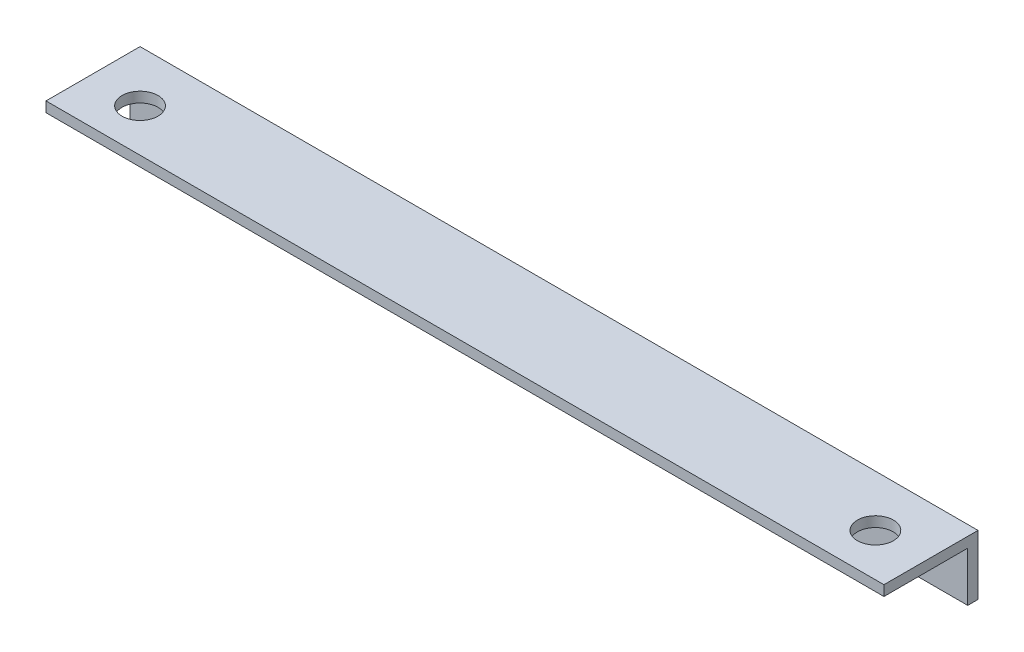
ISO-10303-21;
HEADER;
FILE_DESCRIPTION(('STEP AP214'),'2;1');
FILE_NAME('part.step','',(''),(''),'','','');
FILE_SCHEMA(('AUTOMOTIVE_DESIGN { 1 0 10303 214 1 1 1 1 }'));
ENDSEC;
DATA;
#1=APPLICATION_CONTEXT('core data for automotive mechanical design processes');
#2=APPLICATION_PROTOCOL_DEFINITION('international standard','automotive_design',2000,#1);
#3=PRODUCT_CONTEXT('',#1,'mechanical');
#4=PRODUCT('Part','Part','',(#3));
#5=PRODUCT_RELATED_PRODUCT_CATEGORY('part','',(#4));
#6=PRODUCT_DEFINITION_FORMATION('','',#4);
#7=PRODUCT_DEFINITION_CONTEXT('part definition',#1,'design');
#8=PRODUCT_DEFINITION('design','',#6,#7);
#9=PRODUCT_DEFINITION_SHAPE('','',#8);
#10=(LENGTH_UNIT() NAMED_UNIT(*) SI_UNIT(.MILLI.,.METRE.));
#11=(NAMED_UNIT(*) PLANE_ANGLE_UNIT() SI_UNIT($,.RADIAN.));
#12=(NAMED_UNIT(*) SI_UNIT($,.STERADIAN.) SOLID_ANGLE_UNIT());
#13=UNCERTAINTY_MEASURE_WITH_UNIT(LENGTH_MEASURE(1.E-05),#10,'distance_accuracy_value','');
#14=(GEOMETRIC_REPRESENTATION_CONTEXT(3) GLOBAL_UNCERTAINTY_ASSIGNED_CONTEXT((#13)) GLOBAL_UNIT_ASSIGNED_CONTEXT((#10,
#11,#12)) REPRESENTATION_CONTEXT('',''));
#15=CARTESIAN_POINT('',(0.,0.,0.));
#16=DIRECTION('',(0.,0.,1.));
#17=DIRECTION('',(1.,0.,0.));
#18=AXIS2_PLACEMENT_3D('',#15,#16,#17);
#19=CARTESIAN_POINT('',(0.,0.,1.2));
#20=DIRECTION('',(0.,0.,-1.));
#21=DIRECTION('',(-1.,0.,0.));
#22=AXIS2_PLACEMENT_3D('',#19,#20,#21);
#23=PLANE('',#22);
#24=DIRECTION('',(0.,1.,0.));
#25=VECTOR('',#24,1.);
#26=CARTESIAN_POINT('',(49.,-3.5,1.2));
#27=LINE('',#26,#25);
#28=CARTESIAN_POINT('',(49.,-3.5,1.2));
#29=VERTEX_POINT('',#28);
#30=CARTESIAN_POINT('',(49.,2.3,1.2));
#31=VERTEX_POINT('',#30);
#32=EDGE_CURVE('E94',#29,#31,#27,.T.);
#33=ORIENTED_EDGE('',*,*,#32,.T.);
#34=DIRECTION('',(-1.,0.,0.));
#35=VECTOR('',#34,1.);
#36=CARTESIAN_POINT('',(-49.,2.3,1.2));
#37=LINE('',#36,#35);
#38=CARTESIAN_POINT('',(-49.,2.3,1.2));
#39=VERTEX_POINT('',#38);
#40=EDGE_CURVE('E152',#31,#39,#37,.T.);
#41=ORIENTED_EDGE('',*,*,#40,.T.);
#42=DIRECTION('',(0.,-1.,0.));
#43=VECTOR('',#42,1.);
#44=CARTESIAN_POINT('',(-49.,-3.5,1.2));
#45=LINE('',#44,#43);
#46=CARTESIAN_POINT('',(-49.,-3.5,1.2));
#47=VERTEX_POINT('',#46);
#48=EDGE_CURVE('E160',#39,#47,#45,.T.);
#49=ORIENTED_EDGE('',*,*,#48,.T.);
#50=DIRECTION('',(1.,0.,0.));
#51=VECTOR('',#50,1.);
#52=CARTESIAN_POINT('',(-49.,-3.5,1.2));
#53=LINE('',#52,#51);
#54=EDGE_CURVE('E64',#47,#29,#53,.T.);
#55=ORIENTED_EDGE('',*,*,#54,.T.);
#56=EDGE_LOOP('',(#33,#41,#49,#55));
#57=FACE_BOUND('',#56,.T.);
#58=CARTESIAN_POINT('',(-35.,-0.700000000000001,1.2));
#59=DIRECTION('',(0.,0.,1.));
#60=DIRECTION('',(1.,0.,0.));
#61=AXIS2_PLACEMENT_3D('',#58,#59,#60);
#62=CIRCLE('',#61,1.6);
#63=CARTESIAN_POINT('',(-33.4,-0.700000000000001,1.2));
#64=VERTEX_POINT('',#63);
#65=EDGE_CURVE('E108',#64,#64,#62,.T.);
#66=ORIENTED_EDGE('',*,*,#65,.F.);
#67=EDGE_LOOP('',(#66));
#68=FACE_BOUND('',#67,.T.);
#69=CARTESIAN_POINT('',(35.,-0.700000000000001,1.2));
#70=DIRECTION('',(0.,0.,1.));
#71=DIRECTION('',(-1.,0.,0.));
#72=AXIS2_PLACEMENT_3D('',#69,#70,#71);
#73=CIRCLE('',#72,1.6);
#74=CARTESIAN_POINT('',(33.4,-0.700000000000001,1.2));
#75=VERTEX_POINT('',#74);
#76=EDGE_CURVE('E177',#75,#75,#73,.T.);
#77=ORIENTED_EDGE('',*,*,#76,.F.);
#78=EDGE_LOOP('',(#77));
#79=FACE_BOUND('',#78,.T.);
#80=ADVANCED_FACE('F39',(#57,#68,#79),#23,.F.);
#81=CARTESIAN_POINT('',(0.,0.,0.));
#82=DIRECTION('',(0.,0.,-1.));
#83=DIRECTION('',(-1.,0.,0.));
#84=AXIS2_PLACEMENT_3D('',#81,#82,#83);
#85=PLANE('',#84);
#86=CARTESIAN_POINT('',(-35.,-0.700000000000001,0.));
#87=DIRECTION('',(0.,0.,1.));
#88=DIRECTION('',(1.,0.,0.));
#89=AXIS2_PLACEMENT_3D('',#86,#87,#88);
#90=CIRCLE('',#89,1.6);
#91=CARTESIAN_POINT('',(-33.4,-0.700000000000001,0.));
#92=VERTEX_POINT('',#91);
#93=EDGE_CURVE('E114',#92,#92,#90,.T.);
#94=ORIENTED_EDGE('',*,*,#93,.T.);
#95=EDGE_LOOP('',(#94));
#96=FACE_BOUND('',#95,.T.);
#97=DIRECTION('',(0.,1.,0.));
#98=VECTOR('',#97,1.);
#99=CARTESIAN_POINT('',(49.,-3.5,0.));
#100=LINE('',#99,#98);
#101=CARTESIAN_POINT('',(49.,-3.5,0.));
#102=VERTEX_POINT('',#101);
#103=CARTESIAN_POINT('',(49.,3.5,0.));
#104=VERTEX_POINT('',#103);
#105=EDGE_CURVE('E100',#102,#104,#100,.T.);
#106=ORIENTED_EDGE('',*,*,#105,.F.);
#107=DIRECTION('',(1.,0.,0.));
#108=VECTOR('',#107,1.);
#109=CARTESIAN_POINT('',(-49.,-3.5,0.));
#110=LINE('',#109,#108);
#111=CARTESIAN_POINT('',(-49.,-3.5,0.));
#112=VERTEX_POINT('',#111);
#113=EDGE_CURVE('E83',#112,#102,#110,.T.);
#114=ORIENTED_EDGE('',*,*,#113,.F.);
#115=DIRECTION('',(0.,-1.,0.));
#116=VECTOR('',#115,1.);
#117=CARTESIAN_POINT('',(-49.,-3.5,0.));
#118=LINE('',#117,#116);
#119=CARTESIAN_POINT('',(-49.,3.5,0.));
#120=VERTEX_POINT('',#119);
#121=EDGE_CURVE('E95',#120,#112,#118,.T.);
#122=ORIENTED_EDGE('',*,*,#121,.F.);
#123=DIRECTION('',(-1.,0.,0.));
#124=VECTOR('',#123,1.);
#125=CARTESIAN_POINT('',(-49.,3.5,0.));
#126=LINE('',#125,#124);
#127=EDGE_CURVE('E106',#104,#120,#126,.T.);
#128=ORIENTED_EDGE('',*,*,#127,.F.);
#129=EDGE_LOOP('',(#106,#114,#122,#128));
#130=FACE_BOUND('',#129,.T.);
#131=CARTESIAN_POINT('',(35.,-0.700000000000001,0.));
#132=DIRECTION('',(0.,0.,1.));
#133=DIRECTION('',(-1.,0.,0.));
#134=AXIS2_PLACEMENT_3D('',#131,#132,#133);
#135=CIRCLE('',#134,1.6);
#136=CARTESIAN_POINT('',(33.4,-0.700000000000001,0.));
#137=VERTEX_POINT('',#136);
#138=EDGE_CURVE('E175',#137,#137,#135,.T.);
#139=ORIENTED_EDGE('',*,*,#138,.T.);
#140=EDGE_LOOP('',(#139));
#141=FACE_BOUND('',#140,.T.);
#142=ADVANCED_FACE('F104',(#96,#130,#141),#85,.T.);
#143=CARTESIAN_POINT('',(49.,-3.5,1.2));
#144=DIRECTION('',(-1.,0.,0.));
#145=DIRECTION('',(0.,0.,1.));
#146=AXIS2_PLACEMENT_3D('',#143,#144,#145);
#147=PLANE('',#146);
#148=ORIENTED_EDGE('',*,*,#105,.T.);
#149=DIRECTION('',(0.,0.,-1.));
#150=VECTOR('',#149,1.);
#151=CARTESIAN_POINT('',(49.,3.5,1.2));
#152=LINE('',#151,#150);
#153=CARTESIAN_POINT('',(49.,3.5,11.));
#154=VERTEX_POINT('',#153);
#155=EDGE_CURVE('E11',#154,#104,#152,.T.);
#156=ORIENTED_EDGE('',*,*,#155,.F.);
#157=DIRECTION('',(0.,1.,0.));
#158=VECTOR('',#157,1.);
#159=CARTESIAN_POINT('',(49.,2.3,11.));
#160=LINE('',#159,#158);
#161=CARTESIAN_POINT('',(49.,2.3,11.));
#162=VERTEX_POINT('',#161);
#163=EDGE_CURVE('E151',#162,#154,#160,.T.);
#164=ORIENTED_EDGE('',*,*,#163,.F.);
#165=DIRECTION('',(0.,0.,-1.));
#166=VECTOR('',#165,1.);
#167=CARTESIAN_POINT('',(49.,2.3,1.2));
#168=LINE('',#167,#166);
#169=EDGE_CURVE('E156',#162,#31,#168,.T.);
#170=ORIENTED_EDGE('',*,*,#169,.T.);
#171=ORIENTED_EDGE('',*,*,#32,.F.);
#172=DIRECTION('',(0.,0.,-1.));
#173=VECTOR('',#172,1.);
#174=CARTESIAN_POINT('',(49.,-3.5,1.2));
#175=LINE('',#174,#173);
#176=EDGE_CURVE('E86',#29,#102,#175,.T.);
#177=ORIENTED_EDGE('',*,*,#176,.T.);
#178=EDGE_LOOP('',(#148,#156,#164,#170,#171,#177));
#179=FACE_BOUND('',#178,.T.);
#180=ADVANCED_FACE('F41',(#179),#147,.F.);
#181=CARTESIAN_POINT('',(-49.,3.5,1.2));
#182=DIRECTION('',(0.,-1.,0.));
#183=DIRECTION('',(0.,0.,-1.));
#184=AXIS2_PLACEMENT_3D('',#181,#182,#183);
#185=PLANE('',#184);
#186=ORIENTED_EDGE('',*,*,#127,.T.);
#187=DIRECTION('',(0.,0.,-1.));
#188=VECTOR('',#187,1.);
#189=CARTESIAN_POINT('',(-49.,3.5,1.2));
#190=LINE('',#189,#188);
#191=CARTESIAN_POINT('',(-49.,3.5,11.));
#192=VERTEX_POINT('',#191);
#193=EDGE_CURVE('E48',#192,#120,#190,.T.);
#194=ORIENTED_EDGE('',*,*,#193,.F.);
#195=DIRECTION('',(1.,0.,0.));
#196=VECTOR('',#195,1.);
#197=CARTESIAN_POINT('',(-49.,3.5,11.));
#198=LINE('',#197,#196);
#199=EDGE_CURVE('E137',#192,#154,#198,.T.);
#200=ORIENTED_EDGE('',*,*,#199,.T.);
#201=ORIENTED_EDGE('',*,*,#155,.T.);
#202=EDGE_LOOP('',(#186,#194,#200,#201));
#203=FACE_BOUND('',#202,.T.);
#204=CARTESIAN_POINT('',(43.,3.5,6.00000000000002));
#205=DIRECTION('',(0.,1.,0.));
#206=DIRECTION('',(0.,0.,-1.));
#207=AXIS2_PLACEMENT_3D('',#204,#205,#206);
#208=CIRCLE('',#207,2.1);
#209=CARTESIAN_POINT('',(43.,3.5,3.90000000000002));
#210=VERTEX_POINT('',#209);
#211=EDGE_CURVE('E315',#210,#210,#208,.T.);
#212=ORIENTED_EDGE('',*,*,#211,.F.);
#213=EDGE_LOOP('',(#212));
#214=FACE_BOUND('',#213,.T.);
#215=CARTESIAN_POINT('',(-43.,3.5,6.00000000000002));
#216=DIRECTION('',(0.,1.,0.));
#217=DIRECTION('',(0.,0.,1.));
#218=AXIS2_PLACEMENT_3D('',#215,#216,#217);
#219=CIRCLE('',#218,2.1);
#220=CARTESIAN_POINT('',(-43.,3.5,8.10000000000001));
#221=VERTEX_POINT('',#220);
#222=EDGE_CURVE('E167',#221,#221,#219,.T.);
#223=ORIENTED_EDGE('',*,*,#222,.F.);
#224=EDGE_LOOP('',(#223));
#225=FACE_BOUND('',#224,.T.);
#226=ADVANCED_FACE('F134',(#203,#214,#225),#185,.F.);
#227=CARTESIAN_POINT('',(-49.,-3.5,1.2));
#228=DIRECTION('',(1.,0.,0.));
#229=DIRECTION('',(0.,0.,-1.));
#230=AXIS2_PLACEMENT_3D('',#227,#228,#229);
#231=PLANE('',#230);
#232=ORIENTED_EDGE('',*,*,#121,.T.);
#233=DIRECTION('',(0.,0.,-1.));
#234=VECTOR('',#233,1.);
#235=CARTESIAN_POINT('',(-49.,-3.5,1.2));
#236=LINE('',#235,#234);
#237=EDGE_CURVE('E89',#47,#112,#236,.T.);
#238=ORIENTED_EDGE('',*,*,#237,.F.);
#239=ORIENTED_EDGE('',*,*,#48,.F.);
#240=DIRECTION('',(0.,0.,1.));
#241=VECTOR('',#240,1.);
#242=CARTESIAN_POINT('',(-49.,2.3,1.2));
#243=LINE('',#242,#241);
#244=CARTESIAN_POINT('',(-49.,2.3,11.));
#245=VERTEX_POINT('',#244);
#246=EDGE_CURVE('E55',#39,#245,#243,.T.);
#247=ORIENTED_EDGE('',*,*,#246,.T.);
#248=DIRECTION('',(0.,1.,0.));
#249=VECTOR('',#248,1.);
#250=CARTESIAN_POINT('',(-49.,2.3,11.));
#251=LINE('',#250,#249);
#252=EDGE_CURVE('E130',#245,#192,#251,.T.);
#253=ORIENTED_EDGE('',*,*,#252,.T.);
#254=ORIENTED_EDGE('',*,*,#193,.T.);
#255=EDGE_LOOP('',(#232,#238,#239,#247,#253,#254));
#256=FACE_BOUND('',#255,.T.);
#257=ADVANCED_FACE('F127',(#256),#231,.F.);
#258=CARTESIAN_POINT('',(-49.,-3.5,1.2));
#259=DIRECTION('',(0.,1.,0.));
#260=DIRECTION('',(0.,0.,1.));
#261=AXIS2_PLACEMENT_3D('',#258,#259,#260);
#262=PLANE('',#261);
#263=ORIENTED_EDGE('',*,*,#113,.T.);
#264=ORIENTED_EDGE('',*,*,#176,.F.);
#265=ORIENTED_EDGE('',*,*,#54,.F.);
#266=ORIENTED_EDGE('',*,*,#237,.T.);
#267=EDGE_LOOP('',(#263,#264,#265,#266));
#268=FACE_BOUND('',#267,.T.);
#269=ADVANCED_FACE('F85',(#268),#262,.F.);
#270=CARTESIAN_POINT('',(-35.,-0.700000000000001,1.2));
#271=DIRECTION('',(0.,0.,-1.));
#272=DIRECTION('',(-1.,0.,0.));
#273=AXIS2_PLACEMENT_3D('',#270,#271,#272);
#274=CYLINDRICAL_SURFACE('',#273,1.6);
#275=ORIENTED_EDGE('',*,*,#65,.T.);
#276=EDGE_LOOP('',(#275));
#277=FACE_BOUND('',#276,.T.);
#278=ORIENTED_EDGE('',*,*,#93,.F.);
#279=EDGE_LOOP('',(#278));
#280=FACE_BOUND('',#279,.T.);
#281=ADVANCED_FACE('F200',(#277,#280),#274,.F.);
#282=CARTESIAN_POINT('',(35.,-0.700000000000001,1.2));
#283=DIRECTION('',(0.,0.,-1.));
#284=DIRECTION('',(-1.,0.,0.));
#285=AXIS2_PLACEMENT_3D('',#282,#283,#284);
#286=CYLINDRICAL_SURFACE('',#285,1.6);
#287=ORIENTED_EDGE('',*,*,#76,.T.);
#288=EDGE_LOOP('',(#287));
#289=FACE_BOUND('',#288,.T.);
#290=ORIENTED_EDGE('',*,*,#138,.F.);
#291=EDGE_LOOP('',(#290));
#292=FACE_BOUND('',#291,.T.);
#293=ADVANCED_FACE('F197',(#289,#292),#286,.F.);
#294=CARTESIAN_POINT('',(-49.,2.3,11.));
#295=DIRECTION('',(0.,0.,1.));
#296=DIRECTION('',(1.,0.,0.));
#297=AXIS2_PLACEMENT_3D('',#294,#295,#296);
#298=PLANE('',#297);
#299=ORIENTED_EDGE('',*,*,#199,.F.);
#300=ORIENTED_EDGE('',*,*,#252,.F.);
#301=DIRECTION('',(1.,0.,0.));
#302=VECTOR('',#301,1.);
#303=CARTESIAN_POINT('',(-49.,2.3,11.));
#304=LINE('',#303,#302);
#305=EDGE_CURVE('E149',#245,#162,#304,.T.);
#306=ORIENTED_EDGE('',*,*,#305,.T.);
#307=ORIENTED_EDGE('',*,*,#163,.T.);
#308=EDGE_LOOP('',(#299,#300,#306,#307));
#309=FACE_BOUND('',#308,.T.);
#310=ADVANCED_FACE('F147',(#309),#298,.T.);
#311=CARTESIAN_POINT('',(0.,2.3,0.));
#312=DIRECTION('',(0.,1.,0.));
#313=DIRECTION('',(0.,0.,1.));
#314=AXIS2_PLACEMENT_3D('',#311,#312,#313);
#315=PLANE('',#314);
#316=CARTESIAN_POINT('',(43.,2.3,6.00000000000002));
#317=DIRECTION('',(0.,1.,0.));
#318=DIRECTION('',(0.,0.,-1.));
#319=AXIS2_PLACEMENT_3D('',#316,#317,#318);
#320=CIRCLE('',#319,2.1);
#321=CARTESIAN_POINT('',(43.,2.3,3.90000000000002));
#322=VERTEX_POINT('',#321);
#323=EDGE_CURVE('E312',#322,#322,#320,.T.);
#324=ORIENTED_EDGE('',*,*,#323,.T.);
#325=EDGE_LOOP('',(#324));
#326=FACE_BOUND('',#325,.T.);
#327=CARTESIAN_POINT('',(-43.,2.3,6.00000000000002));
#328=DIRECTION('',(0.,1.,0.));
#329=DIRECTION('',(0.,0.,1.));
#330=AXIS2_PLACEMENT_3D('',#327,#328,#329);
#331=CIRCLE('',#330,2.1);
#332=CARTESIAN_POINT('',(-43.,2.3,8.10000000000001));
#333=VERTEX_POINT('',#332);
#334=EDGE_CURVE('E164',#333,#333,#331,.T.);
#335=ORIENTED_EDGE('',*,*,#334,.T.);
#336=EDGE_LOOP('',(#335));
#337=FACE_BOUND('',#336,.T.);
#338=ORIENTED_EDGE('',*,*,#246,.F.);
#339=ORIENTED_EDGE('',*,*,#40,.F.);
#340=ORIENTED_EDGE('',*,*,#169,.F.);
#341=ORIENTED_EDGE('',*,*,#305,.F.);
#342=EDGE_LOOP('',(#338,#339,#340,#341));
#343=FACE_BOUND('',#342,.T.);
#344=ADVANCED_FACE('F155',(#326,#337,#343),#315,.F.);
#345=CARTESIAN_POINT('',(-43.,2.3,6.00000000000002));
#346=DIRECTION('',(0.,1.,0.));
#347=DIRECTION('',(0.,0.,1.));
#348=AXIS2_PLACEMENT_3D('',#345,#346,#347);
#349=CYLINDRICAL_SURFACE('',#348,2.1);
#350=ORIENTED_EDGE('',*,*,#334,.F.);
#351=EDGE_LOOP('',(#350));
#352=FACE_BOUND('',#351,.T.);
#353=ORIENTED_EDGE('',*,*,#222,.T.);
#354=EDGE_LOOP('',(#353));
#355=FACE_BOUND('',#354,.T.);
#356=ADVANCED_FACE('F250',(#352,#355),#349,.F.);
#357=CARTESIAN_POINT('',(43.,2.3,6.00000000000002));
#358=DIRECTION('',(0.,1.,0.));
#359=DIRECTION('',(0.,0.,1.));
#360=AXIS2_PLACEMENT_3D('',#357,#358,#359);
#361=CYLINDRICAL_SURFACE('',#360,2.1);
#362=ORIENTED_EDGE('',*,*,#323,.F.);
#363=EDGE_LOOP('',(#362));
#364=FACE_BOUND('',#363,.T.);
#365=ORIENTED_EDGE('',*,*,#211,.T.);
#366=EDGE_LOOP('',(#365));
#367=FACE_BOUND('',#366,.T.);
#368=ADVANCED_FACE('F258',(#364,#367),#361,.F.);
#369=CLOSED_SHELL('',(#80,#142,#180,#226,#257,#269,#281,#293,#310,#344,#356,#368));
#370=MANIFOLD_SOLID_BREP('B2',#369);
#371=ADVANCED_BREP_SHAPE_REPRESENTATION('',(#18,#370),#14);
#372=SHAPE_DEFINITION_REPRESENTATION(#9,#371);
ENDSEC;
END-ISO-10303-21;
